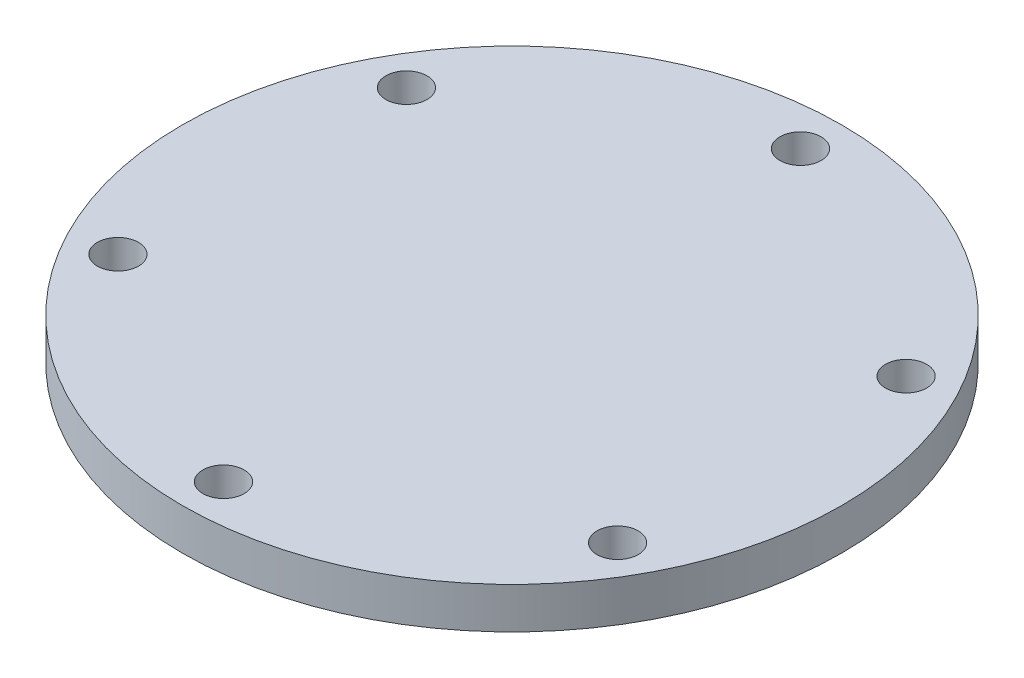
ISO-10303-21;
HEADER;
FILE_DESCRIPTION(('STEP AP214'),'2;1');
FILE_NAME('part.step','',(''),(''),'','','');
FILE_SCHEMA(('AUTOMOTIVE_DESIGN { 1 0 10303 214 1 1 1 1 }'));
ENDSEC;
DATA;
#1=APPLICATION_CONTEXT('core data for automotive mechanical design processes');
#2=APPLICATION_PROTOCOL_DEFINITION('international standard','automotive_design',2000,#1);
#3=PRODUCT_CONTEXT('',#1,'mechanical');
#4=PRODUCT('Part','Part','',(#3));
#5=PRODUCT_RELATED_PRODUCT_CATEGORY('part','',(#4));
#6=PRODUCT_DEFINITION_FORMATION('','',#4);
#7=PRODUCT_DEFINITION_CONTEXT('part definition',#1,'design');
#8=PRODUCT_DEFINITION('design','',#6,#7);
#9=PRODUCT_DEFINITION_SHAPE('','',#8);
#10=(LENGTH_UNIT() NAMED_UNIT(*) SI_UNIT(.MILLI.,.METRE.));
#11=(NAMED_UNIT(*) PLANE_ANGLE_UNIT() SI_UNIT($,.RADIAN.));
#12=(NAMED_UNIT(*) SI_UNIT($,.STERADIAN.) SOLID_ANGLE_UNIT());
#13=UNCERTAINTY_MEASURE_WITH_UNIT(LENGTH_MEASURE(1.E-05),#10,'distance_accuracy_value','');
#14=(GEOMETRIC_REPRESENTATION_CONTEXT(3) GLOBAL_UNCERTAINTY_ASSIGNED_CONTEXT((#13)) GLOBAL_UNIT_ASSIGNED_CONTEXT((#10,
#11,#12)) REPRESENTATION_CONTEXT('',''));
#15=CARTESIAN_POINT('',(0.,0.,0.));
#16=DIRECTION('',(0.,0.,1.));
#17=DIRECTION('',(1.,0.,0.));
#18=AXIS2_PLACEMENT_3D('',#15,#16,#17);
#19=CARTESIAN_POINT('',(0.,21.4962862043671,0.));
#20=DIRECTION('',(0.,1.,0.));
#21=DIRECTION('',(0.,0.,1.));
#22=AXIS2_PLACEMENT_3D('',#19,#20,#21);
#23=CYLINDRICAL_SURFACE('',#22,3.82524);
#24=CARTESIAN_POINT('',(0.,6.604,0.));
#25=DIRECTION('',(0.,1.,0.));
#26=DIRECTION('',(0.,0.,1.));
#27=AXIS2_PLACEMENT_3D('',#24,#25,#26);
#28=CIRCLE('',#27,3.82524);
#29=CARTESIAN_POINT('',(0.,6.604,3.82524));
#30=VERTEX_POINT('',#29);
#31=EDGE_CURVE('E74',#30,#30,#28,.T.);
#32=ORIENTED_EDGE('',*,*,#31,.F.);
#33=EDGE_LOOP('',(#32));
#34=FACE_BOUND('',#33,.T.);
#35=CARTESIAN_POINT('',(0.,5.334,0.));
#36=DIRECTION('',(0.,1.,0.));
#37=DIRECTION('',(0.,0.,1.));
#38=AXIS2_PLACEMENT_3D('',#35,#36,#37);
#39=CIRCLE('',#38,3.82524);
#40=CARTESIAN_POINT('',(0.,5.334,3.82524));
#41=VERTEX_POINT('',#40);
#42=EDGE_CURVE('E86',#41,#41,#39,.T.);
#43=ORIENTED_EDGE('',*,*,#42,.T.);
#44=EDGE_LOOP('',(#43));
#45=FACE_BOUND('',#44,.T.);
#46=ADVANCED_FACE('F35',(#34,#45),#23,.T.);
#47=CARTESIAN_POINT('',(0.,21.4962862043671,0.));
#48=DIRECTION('',(0.,1.,0.));
#49=DIRECTION('',(0.,0.,1.));
#50=AXIS2_PLACEMENT_3D('',#47,#48,#49);
#51=CYLINDRICAL_SURFACE('',#50,12.7);
#52=CARTESIAN_POINT('',(0.,7.874,0.));
#53=DIRECTION('',(0.,1.,0.));
#54=DIRECTION('',(0.,0.,1.));
#55=AXIS2_PLACEMENT_3D('',#52,#53,#54);
#56=CIRCLE('',#55,12.7);
#57=CARTESIAN_POINT('',(0.,7.874,12.7));
#58=VERTEX_POINT('',#57);
#59=EDGE_CURVE('E59',#58,#58,#56,.T.);
#60=ORIENTED_EDGE('',*,*,#59,.F.);
#61=EDGE_LOOP('',(#60));
#62=FACE_BOUND('',#61,.T.);
#63=CARTESIAN_POINT('',(0.,6.604,0.));
#64=DIRECTION('',(0.,1.,0.));
#65=DIRECTION('',(0.,0.,1.));
#66=AXIS2_PLACEMENT_3D('',#63,#64,#65);
#67=CIRCLE('',#66,12.7);
#68=CARTESIAN_POINT('',(0.,6.604,12.7));
#69=VERTEX_POINT('',#68);
#70=EDGE_CURVE('E71',#69,#69,#67,.T.);
#71=ORIENTED_EDGE('',*,*,#70,.T.);
#72=EDGE_LOOP('',(#71));
#73=FACE_BOUND('',#72,.T.);
#74=ADVANCED_FACE('F159',(#62,#73),#51,.T.);
#75=CARTESIAN_POINT('',(0.,11.938,0.));
#76=DIRECTION('',(0.,1.,0.));
#77=DIRECTION('',(0.,0.,1.));
#78=AXIS2_PLACEMENT_3D('',#75,#76,#77);
#79=CIRCLE('',#78,12.7);
#80=CARTESIAN_POINT('',(0.,11.938,12.7));
#81=VERTEX_POINT('',#80);
#82=EDGE_CURVE('E56',#81,#81,#79,.T.);
#83=ORIENTED_EDGE('',*,*,#82,.F.);
#84=EDGE_LOOP('',(#83));
#85=FACE_BOUND('',#84,.T.);
#86=CARTESIAN_POINT('',(0.,10.668,0.));
#87=DIRECTION('',(0.,1.,0.));
#88=DIRECTION('',(0.,0.,1.));
#89=AXIS2_PLACEMENT_3D('',#86,#87,#88);
#90=CIRCLE('',#89,12.7);
#91=CARTESIAN_POINT('',(0.,10.668,12.7));
#92=VERTEX_POINT('',#91);
#93=EDGE_CURVE('E68',#92,#92,#90,.T.);
#94=ORIENTED_EDGE('',*,*,#93,.T.);
#95=EDGE_LOOP('',(#94));
#96=FACE_BOUND('',#95,.T.);
#97=ADVANCED_FACE('F143',(#85,#96),#51,.T.);
#98=CARTESIAN_POINT('',(0.,14.478,0.));
#99=DIRECTION('',(0.,-1.,0.));
#100=DIRECTION('',(0.,0.,-1.));
#101=AXIS2_PLACEMENT_3D('',#98,#99,#100);
#102=CYLINDRICAL_SURFACE('',#101,20.32);
#103=CARTESIAN_POINT('',(0.,14.478,0.));
#104=DIRECTION('',(0.,1.,0.));
#105=DIRECTION('',(0.,0.,1.));
#106=AXIS2_PLACEMENT_3D('',#103,#104,#105);
#107=CIRCLE('',#106,20.32);
#108=CARTESIAN_POINT('',(0.,14.478,20.32));
#109=VERTEX_POINT('',#108);
#110=EDGE_CURVE('E47',#109,#109,#107,.T.);
#111=ORIENTED_EDGE('',*,*,#110,.F.);
#112=EDGE_LOOP('',(#111));
#113=FACE_BOUND('',#112,.T.);
#114=CARTESIAN_POINT('',(0.,11.938,0.));
#115=DIRECTION('',(0.,1.,0.));
#116=DIRECTION('',(0.,0.,1.));
#117=AXIS2_PLACEMENT_3D('',#114,#115,#116);
#118=CIRCLE('',#117,20.32);
#119=CARTESIAN_POINT('',(0.,11.938,20.32));
#120=VERTEX_POINT('',#119);
#121=EDGE_CURVE('E51',#120,#120,#118,.T.);
#122=ORIENTED_EDGE('',*,*,#121,.T.);
#123=EDGE_LOOP('',(#122));
#124=FACE_BOUND('',#123,.T.);
#125=ADVANCED_FACE('F132',(#113,#124),#102,.T.);
#126=CARTESIAN_POINT('',(0.,14.478,0.));
#127=DIRECTION('',(0.,1.,0.));
#128=DIRECTION('',(0.,0.,1.));
#129=AXIS2_PLACEMENT_3D('',#126,#127,#128);
#130=PLANE('',#129);
#131=CARTESIAN_POINT('',(15.3979316792872,14.478,-8.89000000000018));
#132=DIRECTION('',(0.,1.,0.));
#133=DIRECTION('',(-0.866025403784433,0.,0.50000000000001));
#134=AXIS2_PLACEMENT_3D('',#131,#132,#133);
#135=CIRCLE('',#134,1.27);
#136=CARTESIAN_POINT('',(14.298079416481,14.478,-8.25500000000016));
#137=VERTEX_POINT('',#136);
#138=EDGE_CURVE('E105',#137,#137,#135,.T.);
#139=ORIENTED_EDGE('',*,*,#138,.F.);
#140=EDGE_LOOP('',(#139));
#141=FACE_BOUND('',#140,.T.);
#142=CARTESIAN_POINT('',(15.3979316792874,14.478,8.88999999999986));
#143=DIRECTION('',(0.,1.,0.));
#144=DIRECTION('',(-0.866025403784443,0.,-0.499999999999992));
#145=AXIS2_PLACEMENT_3D('',#142,#143,#144);
#146=CIRCLE('',#145,1.27);
#147=CARTESIAN_POINT('',(14.2980794164812,14.478,8.25499999999987));
#148=VERTEX_POINT('',#147);
#149=EDGE_CURVE('E111',#148,#148,#146,.T.);
#150=ORIENTED_EDGE('',*,*,#149,.F.);
#151=EDGE_LOOP('',(#150));
#152=FACE_BOUND('',#151,.T.);
#153=CARTESIAN_POINT('',(0.,14.478,17.78));
#154=DIRECTION('',(0.,1.,0.));
#155=DIRECTION('',(0.,0.,-1.));
#156=AXIS2_PLACEMENT_3D('',#153,#154,#155);
#157=CIRCLE('',#156,1.27);
#158=CARTESIAN_POINT('',(0.,14.478,16.51));
#159=VERTEX_POINT('',#158);
#160=EDGE_CURVE('E117',#159,#159,#157,.T.);
#161=ORIENTED_EDGE('',*,*,#160,.F.);
#162=EDGE_LOOP('',(#161));
#163=FACE_BOUND('',#162,.T.);
#164=CARTESIAN_POINT('',(-15.3979316792873,14.478,8.89000000000007));
#165=DIRECTION('',(0.,1.,0.));
#166=DIRECTION('',(0.866025403784436,0.,-0.500000000000004));
#167=AXIS2_PLACEMENT_3D('',#164,#165,#166);
#168=CIRCLE('',#167,1.27);
#169=CARTESIAN_POINT('',(-14.298079416481,14.478,8.25500000000007));
#170=VERTEX_POINT('',#169);
#171=EDGE_CURVE('E99',#170,#170,#168,.T.);
#172=ORIENTED_EDGE('',*,*,#171,.F.);
#173=EDGE_LOOP('',(#172));
#174=FACE_BOUND('',#173,.T.);
#175=CARTESIAN_POINT('',(-15.3979316792873,14.478,-8.88999999999996));
#176=DIRECTION('',(0.,1.,0.));
#177=DIRECTION('',(0.86602540378444,0.,0.499999999999998));
#178=AXIS2_PLACEMENT_3D('',#175,#176,#177);
#179=CIRCLE('',#178,1.27);
#180=CARTESIAN_POINT('',(-14.2980794164811,14.478,-8.25499999999997));
#181=VERTEX_POINT('',#180);
#182=EDGE_CURVE('E93',#181,#181,#179,.T.);
#183=ORIENTED_EDGE('',*,*,#182,.F.);
#184=EDGE_LOOP('',(#183));
#185=FACE_BOUND('',#184,.T.);
#186=CARTESIAN_POINT('',(0.,14.478,-17.78));
#187=DIRECTION('',(0.,1.,0.));
#188=DIRECTION('',(0.,0.,1.));
#189=AXIS2_PLACEMENT_3D('',#186,#187,#188);
#190=CIRCLE('',#189,1.27);
#191=CARTESIAN_POINT('',(0.,14.478,-16.51));
#192=VERTEX_POINT('',#191);
#193=EDGE_CURVE('E89',#192,#192,#190,.T.);
#194=ORIENTED_EDGE('',*,*,#193,.F.);
#195=EDGE_LOOP('',(#194));
#196=FACE_BOUND('',#195,.T.);
#197=ORIENTED_EDGE('',*,*,#110,.T.);
#198=EDGE_LOOP('',(#197));
#199=FACE_BOUND('',#198,.T.);
#200=ADVANCED_FACE('F128',(#141,#152,#163,#174,#185,#196,#199),#130,.T.);
#201=CARTESIAN_POINT('',(20.32,11.938,0.));
#202=DIRECTION('',(0.,-1.,0.));
#203=DIRECTION('',(0.,0.,-1.));
#204=AXIS2_PLACEMENT_3D('',#201,#202,#203);
#205=PLANE('',#204);
#206=CARTESIAN_POINT('',(15.3979316792872,11.938,-8.89000000000018));
#207=DIRECTION('',(0.,-1.,0.));
#208=DIRECTION('',(0.,0.,-1.));
#209=AXIS2_PLACEMENT_3D('',#206,#207,#208);
#210=CIRCLE('',#209,1.27);
#211=CARTESIAN_POINT('',(15.3979316792872,11.938,-10.1600000000002));
#212=VERTEX_POINT('',#211);
#213=EDGE_CURVE('E102',#212,#212,#210,.F.);
#214=ORIENTED_EDGE('',*,*,#213,.T.);
#215=EDGE_LOOP('',(#214));
#216=FACE_BOUND('',#215,.T.);
#217=CARTESIAN_POINT('',(15.3979316792874,11.938,8.88999999999986));
#218=DIRECTION('',(0.,-1.,0.));
#219=DIRECTION('',(0.,0.,-1.));
#220=AXIS2_PLACEMENT_3D('',#217,#218,#219);
#221=CIRCLE('',#220,1.27);
#222=CARTESIAN_POINT('',(15.3979316792874,11.938,7.61999999999986));
#223=VERTEX_POINT('',#222);
#224=EDGE_CURVE('E108',#223,#223,#221,.F.);
#225=ORIENTED_EDGE('',*,*,#224,.T.);
#226=EDGE_LOOP('',(#225));
#227=FACE_BOUND('',#226,.T.);
#228=CARTESIAN_POINT('',(0.,11.938,17.78));
#229=DIRECTION('',(0.,-1.,0.));
#230=DIRECTION('',(0.,0.,-1.));
#231=AXIS2_PLACEMENT_3D('',#228,#229,#230);
#232=CIRCLE('',#231,1.27);
#233=CARTESIAN_POINT('',(0.,11.938,16.51));
#234=VERTEX_POINT('',#233);
#235=EDGE_CURVE('E114',#234,#234,#232,.F.);
#236=ORIENTED_EDGE('',*,*,#235,.T.);
#237=EDGE_LOOP('',(#236));
#238=FACE_BOUND('',#237,.T.);
#239=CARTESIAN_POINT('',(-15.3979316792873,11.938,8.89000000000007));
#240=DIRECTION('',(0.,-1.,0.));
#241=DIRECTION('',(0.,0.,-1.));
#242=AXIS2_PLACEMENT_3D('',#239,#240,#241);
#243=CIRCLE('',#242,1.27);
#244=CARTESIAN_POINT('',(-15.3979316792873,11.938,7.62000000000007));
#245=VERTEX_POINT('',#244);
#246=EDGE_CURVE('E120',#245,#245,#243,.F.);
#247=ORIENTED_EDGE('',*,*,#246,.T.);
#248=EDGE_LOOP('',(#247));
#249=FACE_BOUND('',#248,.T.);
#250=CARTESIAN_POINT('',(-15.3979316792873,11.938,-8.88999999999996));
#251=DIRECTION('',(0.,-1.,0.));
#252=DIRECTION('',(0.,0.,-1.));
#253=AXIS2_PLACEMENT_3D('',#250,#251,#252);
#254=CIRCLE('',#253,1.27);
#255=CARTESIAN_POINT('',(-15.3979316792873,11.938,-10.16));
#256=VERTEX_POINT('',#255);
#257=EDGE_CURVE('E96',#256,#256,#254,.F.);
#258=ORIENTED_EDGE('',*,*,#257,.T.);
#259=EDGE_LOOP('',(#258));
#260=FACE_BOUND('',#259,.T.);
#261=CARTESIAN_POINT('',(0.,11.938,-17.78));
#262=DIRECTION('',(0.,-1.,0.));
#263=DIRECTION('',(0.,0.,-1.));
#264=AXIS2_PLACEMENT_3D('',#261,#262,#263);
#265=CIRCLE('',#264,1.27);
#266=CARTESIAN_POINT('',(0.,11.938,-19.05));
#267=VERTEX_POINT('',#266);
#268=EDGE_CURVE('E90',#267,#267,#265,.F.);
#269=ORIENTED_EDGE('',*,*,#268,.T.);
#270=EDGE_LOOP('',(#269));
#271=FACE_BOUND('',#270,.T.);
#272=ORIENTED_EDGE('',*,*,#82,.T.);
#273=EDGE_LOOP('',(#272));
#274=FACE_BOUND('',#273,.T.);
#275=ORIENTED_EDGE('',*,*,#121,.F.);
#276=EDGE_LOOP('',(#275));
#277=FACE_BOUND('',#276,.T.);
#278=ADVANCED_FACE('F131',(#216,#227,#238,#249,#260,#271,#274,#277),#205,.T.);
#279=CARTESIAN_POINT('',(12.7,7.874,0.));
#280=DIRECTION('',(0.,1.,0.));
#281=DIRECTION('',(0.,0.,1.));
#282=AXIS2_PLACEMENT_3D('',#279,#280,#281);
#283=PLANE('',#282);
#284=ORIENTED_EDGE('',*,*,#59,.T.);
#285=EDGE_LOOP('',(#284));
#286=FACE_BOUND('',#285,.T.);
#287=CARTESIAN_POINT('',(0.,7.874,0.));
#288=DIRECTION('',(0.,1.,0.));
#289=DIRECTION('',(0.,0.,1.));
#290=AXIS2_PLACEMENT_3D('',#287,#288,#289);
#291=CIRCLE('',#290,10.414);
#292=CARTESIAN_POINT('',(0.,7.874,10.414));
#293=VERTEX_POINT('',#292);
#294=EDGE_CURVE('E62',#293,#293,#291,.T.);
#295=ORIENTED_EDGE('',*,*,#294,.F.);
#296=EDGE_LOOP('',(#295));
#297=FACE_BOUND('',#296,.T.);
#298=ADVANCED_FACE('F147',(#286,#297),#283,.T.);
#299=CARTESIAN_POINT('',(0.,21.4962862043671,0.));
#300=DIRECTION('',(0.,1.,0.));
#301=DIRECTION('',(0.,0.,1.));
#302=AXIS2_PLACEMENT_3D('',#299,#300,#301);
#303=CYLINDRICAL_SURFACE('',#302,10.414);
#304=ORIENTED_EDGE('',*,*,#294,.T.);
#305=EDGE_LOOP('',(#304));
#306=FACE_BOUND('',#305,.T.);
#307=CARTESIAN_POINT('',(0.,10.668,0.));
#308=DIRECTION('',(0.,1.,0.));
#309=DIRECTION('',(0.,0.,1.));
#310=AXIS2_PLACEMENT_3D('',#307,#308,#309);
#311=CIRCLE('',#310,10.414);
#312=CARTESIAN_POINT('',(0.,10.668,10.414));
#313=VERTEX_POINT('',#312);
#314=EDGE_CURVE('E65',#313,#313,#311,.T.);
#315=ORIENTED_EDGE('',*,*,#314,.F.);
#316=EDGE_LOOP('',(#315));
#317=FACE_BOUND('',#316,.T.);
#318=ADVANCED_FACE('F153',(#306,#317),#303,.T.);
#319=CARTESIAN_POINT('',(12.7,10.668,0.));
#320=DIRECTION('',(0.,-1.,0.));
#321=DIRECTION('',(0.,0.,-1.));
#322=AXIS2_PLACEMENT_3D('',#319,#320,#321);
#323=PLANE('',#322);
#324=ORIENTED_EDGE('',*,*,#314,.T.);
#325=EDGE_LOOP('',(#324));
#326=FACE_BOUND('',#325,.T.);
#327=ORIENTED_EDGE('',*,*,#93,.F.);
#328=EDGE_LOOP('',(#327));
#329=FACE_BOUND('',#328,.T.);
#330=ADVANCED_FACE('F239',(#326,#329),#323,.T.);
#331=CARTESIAN_POINT('',(12.7,6.604,0.));
#332=DIRECTION('',(0.,-1.,0.));
#333=DIRECTION('',(0.,0.,-1.));
#334=AXIS2_PLACEMENT_3D('',#331,#332,#333);
#335=PLANE('',#334);
#336=ORIENTED_EDGE('',*,*,#31,.T.);
#337=EDGE_LOOP('',(#336));
#338=FACE_BOUND('',#337,.T.);
#339=ORIENTED_EDGE('',*,*,#70,.F.);
#340=EDGE_LOOP('',(#339));
#341=FACE_BOUND('',#340,.T.);
#342=ADVANCED_FACE('F188',(#338,#341),#335,.T.);
#343=CARTESIAN_POINT('',(3.82524,2.53999999999999,0.));
#344=DIRECTION('',(0.,1.,0.));
#345=DIRECTION('',(0.,0.,1.));
#346=AXIS2_PLACEMENT_3D('',#343,#344,#345);
#347=PLANE('',#346);
#348=CARTESIAN_POINT('',(0.,2.53999999999999,0.));
#349=DIRECTION('',(0.,1.,0.));
#350=DIRECTION('',(0.,0.,1.));
#351=AXIS2_PLACEMENT_3D('',#348,#349,#350);
#352=CIRCLE('',#351,3.82524);
#353=CARTESIAN_POINT('',(0.,2.53999999999999,3.82524));
#354=VERTEX_POINT('',#353);
#355=EDGE_CURVE('E77',#354,#354,#352,.T.);
#356=ORIENTED_EDGE('',*,*,#355,.T.);
#357=EDGE_LOOP('',(#356));
#358=FACE_BOUND('',#357,.T.);
#359=CARTESIAN_POINT('',(0.,2.53999999999999,0.));
#360=DIRECTION('',(0.,1.,0.));
#361=DIRECTION('',(0.,0.,1.));
#362=AXIS2_PLACEMENT_3D('',#359,#360,#361);
#363=CIRCLE('',#362,1.53924);
#364=CARTESIAN_POINT('',(0.,2.53999999999999,1.53924));
#365=VERTEX_POINT('',#364);
#366=EDGE_CURVE('E80',#365,#365,#363,.T.);
#367=ORIENTED_EDGE('',*,*,#366,.F.);
#368=EDGE_LOOP('',(#367));
#369=FACE_BOUND('',#368,.T.);
#370=ADVANCED_FACE('F184',(#358,#369),#347,.T.);
#371=CARTESIAN_POINT('',(0.,21.4962862043671,0.));
#372=DIRECTION('',(0.,1.,0.));
#373=DIRECTION('',(0.,0.,1.));
#374=AXIS2_PLACEMENT_3D('',#371,#372,#373);
#375=CYLINDRICAL_SURFACE('',#374,1.53924);
#376=ORIENTED_EDGE('',*,*,#366,.T.);
#377=EDGE_LOOP('',(#376));
#378=FACE_BOUND('',#377,.T.);
#379=CARTESIAN_POINT('',(0.,5.334,0.));
#380=DIRECTION('',(0.,1.,0.));
#381=DIRECTION('',(0.,0.,1.));
#382=AXIS2_PLACEMENT_3D('',#379,#380,#381);
#383=CIRCLE('',#382,1.53924);
#384=CARTESIAN_POINT('',(0.,5.334,1.53924));
#385=VERTEX_POINT('',#384);
#386=EDGE_CURVE('E83',#385,#385,#383,.T.);
#387=ORIENTED_EDGE('',*,*,#386,.F.);
#388=EDGE_LOOP('',(#387));
#389=FACE_BOUND('',#388,.T.);
#390=ADVANCED_FACE('F187',(#378,#389),#375,.T.);
#391=CARTESIAN_POINT('',(3.82524,5.334,0.));
#392=DIRECTION('',(0.,-1.,0.));
#393=DIRECTION('',(0.,0.,-1.));
#394=AXIS2_PLACEMENT_3D('',#391,#392,#393);
#395=PLANE('',#394);
#396=ORIENTED_EDGE('',*,*,#386,.T.);
#397=EDGE_LOOP('',(#396));
#398=FACE_BOUND('',#397,.T.);
#399=ORIENTED_EDGE('',*,*,#42,.F.);
#400=EDGE_LOOP('',(#399));
#401=FACE_BOUND('',#400,.T.);
#402=ADVANCED_FACE('F179',(#398,#401),#395,.T.);
#403=CARTESIAN_POINT('',(0.,0.,0.));
#404=DIRECTION('',(0.,1.,0.));
#405=DIRECTION('',(0.,0.,1.));
#406=AXIS2_PLACEMENT_3D('',#403,#404,#405);
#407=PLANE('',#406);
#408=CARTESIAN_POINT('',(0.,0.,0.));
#409=DIRECTION('',(0.,1.,0.));
#410=DIRECTION('',(0.,0.,1.));
#411=AXIS2_PLACEMENT_3D('',#408,#409,#410);
#412=CIRCLE('',#411,0.0152399999999715);
#413=CARTESIAN_POINT('',(0.,0.,0.0152399999999711));
#414=VERTEX_POINT('',#413);
#415=EDGE_CURVE('E10',#414,#414,#412,.F.);
#416=ORIENTED_EDGE('',*,*,#415,.T.);
#417=EDGE_LOOP('',(#416));
#418=FACE_BOUND('',#417,.T.);
#419=ADVANCED_FACE('F172',(#418),#407,.F.);
#420=CARTESIAN_POINT('',(0.,1.27,0.));
#421=DIRECTION('',(0.,1.,0.));
#422=DIRECTION('',(0.,0.,1.));
#423=AXIS2_PLACEMENT_3D('',#420,#421,#422);
#424=CIRCLE('',#423,3.82524);
#425=CARTESIAN_POINT('',(0.,1.27,3.82524));
#426=VERTEX_POINT('',#425);
#427=EDGE_CURVE('E43',#426,#426,#424,.T.);
#428=ORIENTED_EDGE('',*,*,#427,.T.);
#429=EDGE_LOOP('',(#428));
#430=FACE_BOUND('',#429,.T.);
#431=ORIENTED_EDGE('',*,*,#355,.F.);
#432=EDGE_LOOP('',(#431));
#433=FACE_BOUND('',#432,.T.);
#434=ADVANCED_FACE('F162',(#430,#433),#23,.T.);
#435=CARTESIAN_POINT('',(0.,1.27,0.));
#436=DIRECTION('',(0.,1.,0.));
#437=DIRECTION('',(0.,0.,1.));
#438=AXIS2_PLACEMENT_3D('',#435,#436,#437);
#439=CONICAL_SURFACE('',#438,3.82524,1.24904577239826);
#440=CARTESIAN_POINT('',(0.,0.,0.0152399999999711));
#441=CARTESIAN_POINT('',(0.,0.0132291666666666,0.0549274999999714));
#442=CARTESIAN_POINT('',(0.,0.0264583333333333,0.0946149999999718));
#443=CARTESIAN_POINT('',(0.,0.0529166666666667,0.173989999999972));
#444=CARTESIAN_POINT('',(0.,0.0661458333333334,0.213677499999973));
#445=CARTESIAN_POINT('',(0.,0.0926041666666667,0.293052499999973));
#446=CARTESIAN_POINT('',(0.,0.105833333333333,0.332739999999974));
#447=CARTESIAN_POINT('',(0.,0.132291666666667,0.412114999999974));
#448=CARTESIAN_POINT('',(0.,0.145520833333333,0.451802499999974));
#449=CARTESIAN_POINT('',(0.,0.171979166666667,0.531177499999975));
#450=CARTESIAN_POINT('',(0.,0.185208333333333,0.570864999999975));
#451=CARTESIAN_POINT('',(0.,0.211666666666667,0.650239999999976));
#452=CARTESIAN_POINT('',(0.,0.224895833333333,0.689927499999976));
#453=CARTESIAN_POINT('',(0.,0.251354166666667,0.769302499999977));
#454=CARTESIAN_POINT('',(0.,0.264583333333333,0.808989999999977));
#455=CARTESIAN_POINT('',(0.,0.291041666666667,0.888364999999978));
#456=CARTESIAN_POINT('',(0.,0.304270833333333,0.928052499999978));
#457=CARTESIAN_POINT('',(0.,0.330729166666667,1.00742749999998));
#458=CARTESIAN_POINT('',(0.,0.343958333333333,1.04711499999998));
#459=CARTESIAN_POINT('',(0.,0.370416666666667,1.12648999999998));
#460=CARTESIAN_POINT('',(0.,0.383645833333333,1.16617749999998));
#461=CARTESIAN_POINT('',(0.,0.410104166666667,1.24555249999998));
#462=CARTESIAN_POINT('',(0.,0.423333333333333,1.28523999999998));
#463=CARTESIAN_POINT('',(0.,0.449791666666667,1.36461499999998));
#464=CARTESIAN_POINT('',(0.,0.463020833333333,1.40430249999998));
#465=CARTESIAN_POINT('',(0.,0.489479166666667,1.48367749999998));
#466=CARTESIAN_POINT('',(0.,0.502708333333333,1.52336499999998));
#467=CARTESIAN_POINT('',(0.,0.529166666666667,1.60273999999998));
#468=CARTESIAN_POINT('',(0.,0.542395833333334,1.64242749999998));
#469=CARTESIAN_POINT('',(0.,0.568854166666667,1.72180249999998));
#470=CARTESIAN_POINT('',(0.,0.582083333333333,1.76148999999998));
#471=CARTESIAN_POINT('',(0.,0.608541666666667,1.84086499999998));
#472=CARTESIAN_POINT('',(0.,0.621770833333333,1.88055249999999));
#473=CARTESIAN_POINT('',(0.,0.648229166666667,1.95992749999999));
#474=CARTESIAN_POINT('',(0.,0.661458333333333,1.99961499999999));
#475=CARTESIAN_POINT('',(0.,0.687916666666667,2.07898999999999));
#476=CARTESIAN_POINT('',(0.,0.701145833333333,2.11867749999999));
#477=CARTESIAN_POINT('',(0.,0.727604166666667,2.19805249999999));
#478=CARTESIAN_POINT('',(0.,0.740833333333334,2.23773999999999));
#479=CARTESIAN_POINT('',(0.,0.767291666666667,2.31711499999999));
#480=CARTESIAN_POINT('',(0.,0.780520833333333,2.35680249999999));
#481=CARTESIAN_POINT('',(0.,0.806979166666667,2.43617749999999));
#482=CARTESIAN_POINT('',(0.,0.820208333333334,2.47586499999999));
#483=CARTESIAN_POINT('',(0.,0.846666666666667,2.55523999999999));
#484=CARTESIAN_POINT('',(0.,0.859895833333334,2.59492749999999));
#485=CARTESIAN_POINT('',(0.,0.886354166666667,2.67430249999999));
#486=CARTESIAN_POINT('',(0.,0.899583333333334,2.71398999999999));
#487=CARTESIAN_POINT('',(0.,0.926041666666667,2.79336499999999));
#488=CARTESIAN_POINT('',(0.,0.939270833333333,2.83305249999999));
#489=CARTESIAN_POINT('',(0.,0.965729166666667,2.91242749999999));
#490=CARTESIAN_POINT('',(0.,0.978958333333334,2.95211499999999));
#491=CARTESIAN_POINT('',(0.,1.00541666666667,3.03148999999999));
#492=CARTESIAN_POINT('',(0.,1.01864583333333,3.07117749999999));
#493=CARTESIAN_POINT('',(0.,1.04510416666667,3.15055249999999));
#494=CARTESIAN_POINT('',(0.,1.05833333333333,3.19023999999999));
#495=CARTESIAN_POINT('',(0.,1.08479166666667,3.269615));
#496=CARTESIAN_POINT('',(0.,1.09802083333333,3.3093025));
#497=CARTESIAN_POINT('',(0.,1.12447916666667,3.3886775));
#498=CARTESIAN_POINT('',(0.,1.13770833333333,3.428365));
#499=CARTESIAN_POINT('',(0.,1.16416666666667,3.50774));
#500=CARTESIAN_POINT('',(0.,1.17739583333333,3.5474275));
#501=CARTESIAN_POINT('',(0.,1.20385416666667,3.6268025));
#502=CARTESIAN_POINT('',(0.,1.21708333333333,3.66649));
#503=CARTESIAN_POINT('',(0.,1.24354166666667,3.745865));
#504=CARTESIAN_POINT('',(0.,1.25677083333333,3.7855525));
#505=CARTESIAN_POINT('',(0.,1.27,3.82524));
#506=B_SPLINE_CURVE_WITH_KNOTS('',3,(#440,#441,#442,#443,#444,#445,#446,#447,#448,#449,#450,
#451,#452,#453,#454,#455,#456,#457,#458,#459,#460,#461,#462,#463,#464,#465,#466,#467,#468,#469,
#470,#471,#472,#473,#474,#475,#476,#477,#478,#479,#480,#481,#482,#483,#484,#485,#486,#487,#488,
#489,#490,#491,#492,#493,#494,#495,#496,#497,#498,#499,#500,#501,#502,#503,#504,#505),
.UNSPECIFIED.,.F.,.F.,(4,2,2,2,2,2,2,2,2,2,2,2,2,2,2,2,2,2,2,2,2,2,2,2,2,2,2,2,2,2,2,2,4),(0.,
0.125502894637934,0.251005789275867,0.3765086839138,0.502011578551734,0.627514473189667,
0.7530173678276,0.878520262465534,1.00402315710347,1.1295260517414,1.25502894637933,
1.38053184101727,1.5060347356552,1.63153763029313,1.75704052493107,1.882543419569,
2.00804631420693,2.13354920884487,2.2590521034828,2.38455499812073,2.51005789275867,
2.6355607873966,2.76106368203453,2.88656657667247,3.0120694713104,3.13757236594833,
3.26307526058627,3.3885781552242,3.51408104986213,3.63958394450007,3.765086839138,
3.89058973377593,4.01609262841387),.UNSPECIFIED.);
#507=EDGE_CURVE('BSEAM38',#414,#426,#506,.T.);
#508=ORIENTED_EDGE('',*,*,#415,.F.);
#509=ORIENTED_EDGE('',*,*,#427,.F.);
#510=ORIENTED_EDGE('',*,*,#507,.T.);
#511=ORIENTED_EDGE('',*,*,#507,.F.);
#512=EDGE_LOOP('',(#508,#510,#509,#511));
#513=FACE_BOUND('',#512,.T.);
#514=ADVANCED_FACE('F38',(#513),#439,.T.);
#515=CARTESIAN_POINT('',(0.,-0.000999999999999265,-17.78));
#516=DIRECTION('',(0.,1.,0.));
#517=DIRECTION('',(0.,0.,1.));
#518=AXIS2_PLACEMENT_3D('',#515,#516,#517);
#519=CYLINDRICAL_SURFACE('',#518,1.27);
#520=ORIENTED_EDGE('',*,*,#268,.F.);
#521=EDGE_LOOP('',(#520));
#522=FACE_BOUND('',#521,.T.);
#523=ORIENTED_EDGE('',*,*,#193,.T.);
#524=EDGE_LOOP('',(#523));
#525=FACE_BOUND('',#524,.T.);
#526=ADVANCED_FACE('F177',(#522,#525),#519,.F.);
#527=CARTESIAN_POINT('',(-15.3979316792873,-0.000999999999999265,-8.88999999999996));
#528=DIRECTION('',(0.,1.,0.));
#529=DIRECTION('',(0.,0.,1.));
#530=AXIS2_PLACEMENT_3D('',#527,#528,#529);
#531=CYLINDRICAL_SURFACE('',#530,1.27);
#532=ORIENTED_EDGE('',*,*,#257,.F.);
#533=EDGE_LOOP('',(#532));
#534=FACE_BOUND('',#533,.T.);
#535=ORIENTED_EDGE('',*,*,#182,.T.);
#536=EDGE_LOOP('',(#535));
#537=FACE_BOUND('',#536,.T.);
#538=ADVANCED_FACE('F205',(#534,#537),#531,.F.);
#539=CARTESIAN_POINT('',(-15.3979316792873,-0.000999999999999265,8.89000000000007));
#540=DIRECTION('',(0.,1.,0.));
#541=DIRECTION('',(0.,0.,1.));
#542=AXIS2_PLACEMENT_3D('',#539,#540,#541);
#543=CYLINDRICAL_SURFACE('',#542,1.27);
#544=ORIENTED_EDGE('',*,*,#246,.F.);
#545=EDGE_LOOP('',(#544));
#546=FACE_BOUND('',#545,.T.);
#547=ORIENTED_EDGE('',*,*,#171,.T.);
#548=EDGE_LOOP('',(#547));
#549=FACE_BOUND('',#548,.T.);
#550=ADVANCED_FACE('F126',(#546,#549),#543,.F.);
#551=CARTESIAN_POINT('',(0.,-0.000999999999999265,17.78));
#552=DIRECTION('',(0.,1.,0.));
#553=DIRECTION('',(0.,0.,1.));
#554=AXIS2_PLACEMENT_3D('',#551,#552,#553);
#555=CYLINDRICAL_SURFACE('',#554,1.27);
#556=ORIENTED_EDGE('',*,*,#235,.F.);
#557=EDGE_LOOP('',(#556));
#558=FACE_BOUND('',#557,.T.);
#559=ORIENTED_EDGE('',*,*,#160,.T.);
#560=EDGE_LOOP('',(#559));
#561=FACE_BOUND('',#560,.T.);
#562=ADVANCED_FACE('F217',(#558,#561),#555,.F.);
#563=CARTESIAN_POINT('',(15.3979316792874,-0.000999999999999265,8.88999999999986));
#564=DIRECTION('',(0.,1.,0.));
#565=DIRECTION('',(0.,0.,1.));
#566=AXIS2_PLACEMENT_3D('',#563,#564,#565);
#567=CYLINDRICAL_SURFACE('',#566,1.27);
#568=ORIENTED_EDGE('',*,*,#224,.F.);
#569=EDGE_LOOP('',(#568));
#570=FACE_BOUND('',#569,.T.);
#571=ORIENTED_EDGE('',*,*,#149,.T.);
#572=EDGE_LOOP('',(#571));
#573=FACE_BOUND('',#572,.T.);
#574=ADVANCED_FACE('F213',(#570,#573),#567,.F.);
#575=CARTESIAN_POINT('',(15.3979316792872,-0.000999999999999265,-8.89000000000018));
#576=DIRECTION('',(0.,1.,0.));
#577=DIRECTION('',(0.,0.,1.));
#578=AXIS2_PLACEMENT_3D('',#575,#576,#577);
#579=CYLINDRICAL_SURFACE('',#578,1.27);
#580=ORIENTED_EDGE('',*,*,#213,.F.);
#581=EDGE_LOOP('',(#580));
#582=FACE_BOUND('',#581,.T.);
#583=ORIENTED_EDGE('',*,*,#138,.T.);
#584=EDGE_LOOP('',(#583));
#585=FACE_BOUND('',#584,.T.);
#586=ADVANCED_FACE('F210',(#582,#585),#579,.F.);
#587=CLOSED_SHELL('',(#46,#74,#97,#125,#200,#278,#298,#318,#330,#342,#370,#390,#402,#419,#434,
#514,#526,#538,#550,#562,#574,#586));
#588=MANIFOLD_SOLID_BREP('B2',#587);
#589=ADVANCED_BREP_SHAPE_REPRESENTATION('',(#18,#588),#14);
#590=SHAPE_DEFINITION_REPRESENTATION(#9,#589);
ENDSEC;
END-ISO-10303-21;
